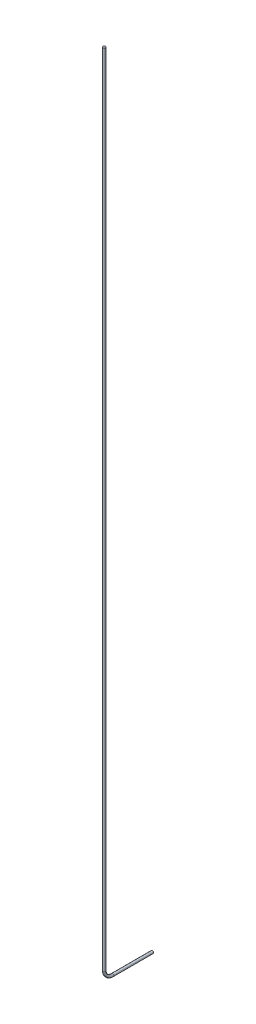
ISO-10303-21;
HEADER;
FILE_DESCRIPTION(('STEP AP214'),'2;1');
FILE_NAME('part.step','',(''),(''),'','','');
FILE_SCHEMA(('AUTOMOTIVE_DESIGN { 1 0 10303 214 1 1 1 1 }'));
ENDSEC;
DATA;
#1=APPLICATION_CONTEXT('core data for automotive mechanical design processes');
#2=APPLICATION_PROTOCOL_DEFINITION('international standard','automotive_design',2000,#1);
#3=PRODUCT_CONTEXT('',#1,'mechanical');
#4=PRODUCT('Part','Part','',(#3));
#5=PRODUCT_RELATED_PRODUCT_CATEGORY('part','',(#4));
#6=PRODUCT_DEFINITION_FORMATION('','',#4);
#7=PRODUCT_DEFINITION_CONTEXT('part definition',#1,'design');
#8=PRODUCT_DEFINITION('design','',#6,#7);
#9=PRODUCT_DEFINITION_SHAPE('','',#8);
#10=(LENGTH_UNIT() NAMED_UNIT(*) SI_UNIT(.MILLI.,.METRE.));
#11=(NAMED_UNIT(*) PLANE_ANGLE_UNIT() SI_UNIT($,.RADIAN.));
#12=(NAMED_UNIT(*) SI_UNIT($,.STERADIAN.) SOLID_ANGLE_UNIT());
#13=UNCERTAINTY_MEASURE_WITH_UNIT(LENGTH_MEASURE(1.E-05),#10,'distance_accuracy_value','');
#14=(GEOMETRIC_REPRESENTATION_CONTEXT(3) GLOBAL_UNCERTAINTY_ASSIGNED_CONTEXT((#13)) GLOBAL_UNIT_ASSIGNED_CONTEXT((#10,
#11,#12)) REPRESENTATION_CONTEXT('',''));
#15=CARTESIAN_POINT('',(0.,0.,0.));
#16=DIRECTION('',(0.,0.,1.));
#17=DIRECTION('',(1.,0.,0.));
#18=AXIS2_PLACEMENT_3D('',#15,#16,#17);
#19=CARTESIAN_POINT('',(0.,0.,20.));
#20=DIRECTION('',(0.,0.,-1.));
#21=DIRECTION('',(-1.,0.,0.));
#22=AXIS2_PLACEMENT_3D('',#19,#20,#21);
#23=CYLINDRICAL_SURFACE('',#22,0.8);
#24=CARTESIAN_POINT('',(0.,0.,0.));
#25=DIRECTION('',(0.,0.,1.));
#26=DIRECTION('',(1.,0.,0.));
#27=AXIS2_PLACEMENT_3D('',#24,#25,#26);
#28=CIRCLE('',#27,0.8);
#29=CARTESIAN_POINT('',(0.8,0.,0.));
#30=VERTEX_POINT('',#29);
#31=EDGE_CURVE('E10',#30,#30,#28,.T.);
#32=ORIENTED_EDGE('',*,*,#31,.T.);
#33=EDGE_LOOP('',(#32));
#34=FACE_BOUND('',#33,.T.);
#35=CARTESIAN_POINT('',(0.,0.,25.));
#36=DIRECTION('',(0.,0.,1.));
#37=DIRECTION('',(1.,0.,0.));
#38=AXIS2_PLACEMENT_3D('',#35,#36,#37);
#39=CIRCLE('',#38,0.8);
#40=CARTESIAN_POINT('',(0.,-0.799999999999836,25.));
#41=VERTEX_POINT('',#40);
#42=EDGE_CURVE('E50',#41,#41,#39,.T.);
#43=ORIENTED_EDGE('',*,*,#42,.F.);
#44=EDGE_LOOP('',(#43));
#45=FACE_BOUND('',#44,.T.);
#46=ADVANCED_FACE('F36',(#34,#45),#23,.T.);
#47=CARTESIAN_POINT('',(0.,0.,0.));
#48=DIRECTION('',(0.,0.,1.));
#49=DIRECTION('',(1.,0.,0.));
#50=AXIS2_PLACEMENT_3D('',#47,#48,#49);
#51=PLANE('',#50);
#52=ORIENTED_EDGE('',*,*,#31,.F.);
#53=EDGE_LOOP('',(#52));
#54=FACE_BOUND('',#53,.T.);
#55=ADVANCED_FACE('F59',(#54),#51,.F.);
#56=CARTESIAN_POINT('',(0.,505.,30.));
#57=DIRECTION('',(0.,1.,0.));
#58=DIRECTION('',(1.,0.,0.));
#59=AXIS2_PLACEMENT_3D('',#56,#57,#58);
#60=PLANE('',#59);
#61=CARTESIAN_POINT('',(0.,505.,30.));
#62=DIRECTION('',(0.,1.,0.));
#63=DIRECTION('',(1.,0.,0.));
#64=AXIS2_PLACEMENT_3D('',#61,#62,#63);
#65=CIRCLE('',#64,0.8);
#66=CARTESIAN_POINT('',(0.8,505.,30.));
#67=VERTEX_POINT('',#66);
#68=EDGE_CURVE('E42',#67,#67,#65,.T.);
#69=ORIENTED_EDGE('',*,*,#68,.T.);
#70=EDGE_LOOP('',(#69));
#71=FACE_BOUND('',#70,.T.);
#72=ADVANCED_FACE('F63',(#71),#60,.T.);
#73=CARTESIAN_POINT('',(0.,5.,25.));
#74=DIRECTION('',(-1.,0.,0.));
#75=DIRECTION('',(0.,0.,1.));
#76=AXIS2_PLACEMENT_3D('',#73,#74,#75);
#77=TOROIDAL_SURFACE('',#76,4.99999999999984,0.8);
#78=CARTESIAN_POINT('',(0.,5.,30.));
#79=DIRECTION('',(0.,1.,0.));
#80=DIRECTION('',(1.,0.,0.));
#81=AXIS2_PLACEMENT_3D('',#78,#79,#80);
#82=CIRCLE('',#81,0.8);
#83=CARTESIAN_POINT('',(0.,5.,30.7999999999998));
#84=VERTEX_POINT('',#83);
#85=EDGE_CURVE('E46',#84,#84,#82,.T.);
#86=CARTESIAN_POINT('',(0.,5.,25.));
#87=DIRECTION('',(-1.,0.,0.));
#88=DIRECTION('',(0.,0.,1.));
#89=AXIS2_PLACEMENT_3D('',#86,#87,#88);
#90=CIRCLE('',#89,5.79999999999984);
#91=EDGE_CURVE('',#41,#84,#90,.T.);
#92=ORIENTED_EDGE('',*,*,#42,.T.);
#93=ORIENTED_EDGE('',*,*,#85,.F.);
#94=ORIENTED_EDGE('',*,*,#91,.T.);
#95=ORIENTED_EDGE('',*,*,#91,.F.);
#96=EDGE_LOOP('',(#92,#94,#93,#95));
#97=FACE_BOUND('',#96,.T.);
#98=ADVANCED_FACE('F56',(#97),#77,.T.);
#99=CARTESIAN_POINT('',(0.,5.,30.));
#100=DIRECTION('',(0.,1.,0.));
#101=DIRECTION('',(0.,0.,1.));
#102=AXIS2_PLACEMENT_3D('',#99,#100,#101);
#103=CYLINDRICAL_SURFACE('',#102,0.8);
#104=ORIENTED_EDGE('',*,*,#68,.F.);
#105=EDGE_LOOP('',(#104));
#106=FACE_BOUND('',#105,.T.);
#107=ORIENTED_EDGE('',*,*,#85,.T.);
#108=EDGE_LOOP('',(#107));
#109=FACE_BOUND('',#108,.T.);
#110=ADVANCED_FACE('F65',(#106,#109),#103,.T.);
#111=CLOSED_SHELL('',(#46,#55,#72,#98,#110));
#112=MANIFOLD_SOLID_BREP('B2',#111);
#113=ADVANCED_BREP_SHAPE_REPRESENTATION('',(#18,#112),#14);
#114=SHAPE_DEFINITION_REPRESENTATION(#9,#113);
ENDSEC;
END-ISO-10303-21;
